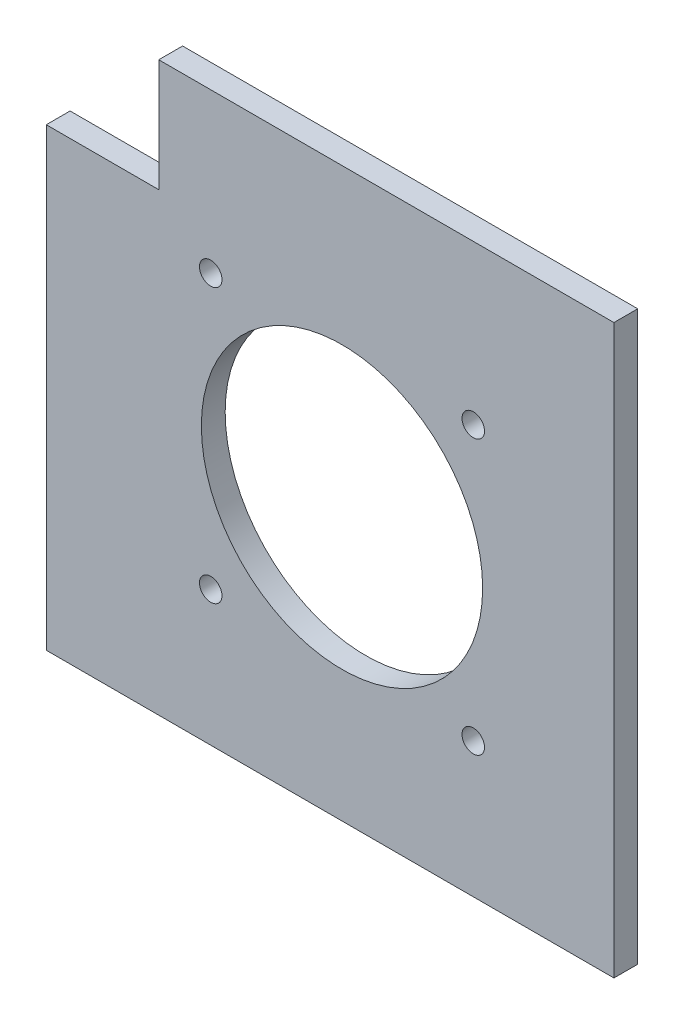
ISO-10303-21;
HEADER;
FILE_DESCRIPTION(('STEP AP214'),'2;1');
FILE_NAME('part.step','',(''),(''),'','','');
FILE_SCHEMA(('AUTOMOTIVE_DESIGN { 1 0 10303 214 1 1 1 1 }'));
ENDSEC;
DATA;
#1=APPLICATION_CONTEXT('core data for automotive mechanical design processes');
#2=APPLICATION_PROTOCOL_DEFINITION('international standard','automotive_design',2000,#1);
#3=PRODUCT_CONTEXT('',#1,'mechanical');
#4=PRODUCT('Part','Part','',(#3));
#5=PRODUCT_RELATED_PRODUCT_CATEGORY('part','',(#4));
#6=PRODUCT_DEFINITION_FORMATION('','',#4);
#7=PRODUCT_DEFINITION_CONTEXT('part definition',#1,'design');
#8=PRODUCT_DEFINITION('design','',#6,#7);
#9=PRODUCT_DEFINITION_SHAPE('','',#8);
#10=(LENGTH_UNIT() NAMED_UNIT(*) SI_UNIT(.MILLI.,.METRE.));
#11=(NAMED_UNIT(*) PLANE_ANGLE_UNIT() SI_UNIT($,.RADIAN.));
#12=(NAMED_UNIT(*) SI_UNIT($,.STERADIAN.) SOLID_ANGLE_UNIT());
#13=UNCERTAINTY_MEASURE_WITH_UNIT(LENGTH_MEASURE(1.E-05),#10,'distance_accuracy_value','');
#14=(GEOMETRIC_REPRESENTATION_CONTEXT(3) GLOBAL_UNCERTAINTY_ASSIGNED_CONTEXT((#13)) GLOBAL_UNIT_ASSIGNED_CONTEXT((#10,
#11,#12)) REPRESENTATION_CONTEXT('',''));
#15=CARTESIAN_POINT('',(0.,0.,0.));
#16=DIRECTION('',(0.,0.,1.));
#17=DIRECTION('',(1.,0.,0.));
#18=AXIS2_PLACEMENT_3D('',#15,#16,#17);
#19=CARTESIAN_POINT('',(100.993484022736,-125.866705607477,6.35));
#20=DIRECTION('',(-1.,0.,0.));
#21=DIRECTION('',(0.,-1.,0.));
#22=AXIS2_PLACEMENT_3D('',#19,#20,#21);
#23=PLANE('',#22);
#24=DIRECTION('',(0.,1.,0.));
#25=VECTOR('',#24,1.);
#26=CARTESIAN_POINT('',(100.993484022736,-125.866705607477,0.));
#27=LINE('',#26,#25);
#28=CARTESIAN_POINT('',(100.993484022736,-125.866705607477,0.));
#29=VERTEX_POINT('',#28);
#30=CARTESIAN_POINT('',(100.993484022736,25.4832943925233,0.));
#31=VERTEX_POINT('',#30);
#32=EDGE_CURVE('E131',#29,#31,#27,.T.);
#33=ORIENTED_EDGE('',*,*,#32,.T.);
#34=DIRECTION('',(0.,0.,-1.));
#35=VECTOR('',#34,1.);
#36=CARTESIAN_POINT('',(100.993484022736,25.4832943925233,6.35));
#37=LINE('',#36,#35);
#38=CARTESIAN_POINT('',(100.993484022736,25.4832943925233,6.35));
#39=VERTEX_POINT('',#38);
#40=EDGE_CURVE('E11',#39,#31,#37,.T.);
#41=ORIENTED_EDGE('',*,*,#40,.F.);
#42=DIRECTION('',(0.,1.,0.));
#43=VECTOR('',#42,1.);
#44=CARTESIAN_POINT('',(100.993484022736,-125.866705607477,6.35));
#45=LINE('',#44,#43);
#46=CARTESIAN_POINT('',(100.993484022736,-125.866705607477,6.35));
#47=VERTEX_POINT('',#46);
#48=EDGE_CURVE('E148',#47,#39,#45,.T.);
#49=ORIENTED_EDGE('',*,*,#48,.F.);
#50=DIRECTION('',(0.,0.,-1.));
#51=VECTOR('',#50,1.);
#52=CARTESIAN_POINT('',(100.993484022736,-125.866705607477,6.35));
#53=LINE('',#52,#51);
#54=EDGE_CURVE('E127',#47,#29,#53,.T.);
#55=ORIENTED_EDGE('',*,*,#54,.T.);
#56=EDGE_LOOP('',(#33,#41,#49,#55));
#57=FACE_BOUND('',#56,.T.);
#58=ADVANCED_FACE('F42',(#57),#23,.F.);
#59=CARTESIAN_POINT('',(100.993484022736,25.4832943925233,6.35));
#60=DIRECTION('',(0.,-1.,0.));
#61=DIRECTION('',(1.,0.,0.));
#62=AXIS2_PLACEMENT_3D('',#59,#60,#61);
#63=PLANE('',#62);
#64=DIRECTION('',(-1.,0.,0.));
#65=VECTOR('',#64,1.);
#66=CARTESIAN_POINT('',(100.993484022736,25.4832943925233,0.));
#67=LINE('',#66,#65);
#68=CARTESIAN_POINT('',(-20.3565159772635,25.4832943925234,0.));
#69=VERTEX_POINT('',#68);
#70=EDGE_CURVE('E135',#31,#69,#67,.T.);
#71=ORIENTED_EDGE('',*,*,#70,.T.);
#72=DIRECTION('',(0.,0.,-1.));
#73=VECTOR('',#72,1.);
#74=CARTESIAN_POINT('',(-20.3565159772635,25.4832943925234,6.35));
#75=LINE('',#74,#73);
#76=CARTESIAN_POINT('',(-20.3565159772635,25.4832943925234,6.35));
#77=VERTEX_POINT('',#76);
#78=EDGE_CURVE('E51',#77,#69,#75,.T.);
#79=ORIENTED_EDGE('',*,*,#78,.F.);
#80=DIRECTION('',(-1.,0.,0.));
#81=VECTOR('',#80,1.);
#82=CARTESIAN_POINT('',(100.993484022736,25.4832943925233,6.35));
#83=LINE('',#82,#81);
#84=EDGE_CURVE('E96',#39,#77,#83,.T.);
#85=ORIENTED_EDGE('',*,*,#84,.F.);
#86=ORIENTED_EDGE('',*,*,#40,.T.);
#87=EDGE_LOOP('',(#71,#79,#85,#86));
#88=FACE_BOUND('',#87,.T.);
#89=ADVANCED_FACE('F178',(#88),#63,.F.);
#90=CARTESIAN_POINT('',(-20.3565159772635,25.4832943925234,6.35));
#91=DIRECTION('',(1.,0.,0.));
#92=DIRECTION('',(0.,0.,-1.));
#93=AXIS2_PLACEMENT_3D('',#90,#91,#92);
#94=PLANE('',#93);
#95=DIRECTION('',(0.,-1.,0.));
#96=VECTOR('',#95,1.);
#97=CARTESIAN_POINT('',(-20.3565159772635,25.4832943925234,0.));
#98=LINE('',#97,#96);
#99=CARTESIAN_POINT('',(-20.3565159772635,-4.51670560747663,0.));
#100=VERTEX_POINT('',#99);
#101=EDGE_CURVE('E139',#69,#100,#98,.T.);
#102=ORIENTED_EDGE('',*,*,#101,.T.);
#103=DIRECTION('',(0.,0.,-1.));
#104=VECTOR('',#103,1.);
#105=CARTESIAN_POINT('',(-20.3565159772635,-4.51670560747663,6.35));
#106=LINE('',#105,#104);
#107=CARTESIAN_POINT('',(-20.3565159772635,-4.51670560747663,6.35));
#108=VERTEX_POINT('',#107);
#109=EDGE_CURVE('E120',#108,#100,#106,.T.);
#110=ORIENTED_EDGE('',*,*,#109,.F.);
#111=DIRECTION('',(0.,-1.,0.));
#112=VECTOR('',#111,1.);
#113=CARTESIAN_POINT('',(-20.3565159772635,25.4832943925234,6.35));
#114=LINE('',#113,#112);
#115=EDGE_CURVE('E109',#77,#108,#114,.T.);
#116=ORIENTED_EDGE('',*,*,#115,.F.);
#117=ORIENTED_EDGE('',*,*,#78,.T.);
#118=EDGE_LOOP('',(#102,#110,#116,#117));
#119=FACE_BOUND('',#118,.T.);
#120=ADVANCED_FACE('F158',(#119),#94,.F.);
#121=CARTESIAN_POINT('',(-50.3565159772635,-4.51670560747663,6.35));
#122=DIRECTION('',(0.,-1.,0.));
#123=DIRECTION('',(0.,0.,-1.));
#124=AXIS2_PLACEMENT_3D('',#121,#122,#123);
#125=PLANE('',#124);
#126=DIRECTION('',(-1.,0.,0.));
#127=VECTOR('',#126,1.);
#128=CARTESIAN_POINT('',(-50.3565159772635,-4.51670560747663,0.));
#129=LINE('',#128,#127);
#130=CARTESIAN_POINT('',(-50.3565159772635,-4.51670560747663,0.));
#131=VERTEX_POINT('',#130);
#132=EDGE_CURVE('E118',#100,#131,#129,.T.);
#133=ORIENTED_EDGE('',*,*,#132,.T.);
#134=DIRECTION('',(0.,0.,-1.));
#135=VECTOR('',#134,1.);
#136=CARTESIAN_POINT('',(-50.3565159772635,-4.51670560747663,6.35));
#137=LINE('',#136,#135);
#138=CARTESIAN_POINT('',(-50.3565159772635,-4.51670560747663,6.35));
#139=VERTEX_POINT('',#138);
#140=EDGE_CURVE('E115',#139,#131,#137,.T.);
#141=ORIENTED_EDGE('',*,*,#140,.F.);
#142=DIRECTION('',(-1.,0.,0.));
#143=VECTOR('',#142,1.);
#144=CARTESIAN_POINT('',(-50.3565159772635,-4.51670560747663,6.35));
#145=LINE('',#144,#143);
#146=EDGE_CURVE('E103',#108,#139,#145,.T.);
#147=ORIENTED_EDGE('',*,*,#146,.F.);
#148=ORIENTED_EDGE('',*,*,#109,.T.);
#149=EDGE_LOOP('',(#133,#141,#147,#148));
#150=FACE_BOUND('',#149,.T.);
#151=ADVANCED_FACE('F116',(#150),#125,.F.);
#152=CARTESIAN_POINT('',(-50.3565159772635,-4.51670560747663,6.35));
#153=DIRECTION('',(1.,0.,0.));
#154=DIRECTION('',(0.,0.,-1.));
#155=AXIS2_PLACEMENT_3D('',#152,#153,#154);
#156=PLANE('',#155);
#157=DIRECTION('',(0.,-1.,0.));
#158=VECTOR('',#157,1.);
#159=CARTESIAN_POINT('',(-50.3565159772635,-4.51670560747663,0.));
#160=LINE('',#159,#158);
#161=CARTESIAN_POINT('',(-50.3565159772635,-125.866705607477,0.));
#162=VERTEX_POINT('',#161);
#163=EDGE_CURVE('E82',#131,#162,#160,.T.);
#164=ORIENTED_EDGE('',*,*,#163,.T.);
#165=DIRECTION('',(0.,0.,-1.));
#166=VECTOR('',#165,1.);
#167=CARTESIAN_POINT('',(-50.3565159772635,-125.866705607477,6.35));
#168=LINE('',#167,#166);
#169=CARTESIAN_POINT('',(-50.3565159772635,-125.866705607477,6.35));
#170=VERTEX_POINT('',#169);
#171=EDGE_CURVE('E121',#170,#162,#168,.T.);
#172=ORIENTED_EDGE('',*,*,#171,.F.);
#173=DIRECTION('',(0.,-1.,0.));
#174=VECTOR('',#173,1.);
#175=CARTESIAN_POINT('',(-50.3565159772635,-4.51670560747663,6.35));
#176=LINE('',#175,#174);
#177=EDGE_CURVE('E107',#139,#170,#176,.T.);
#178=ORIENTED_EDGE('',*,*,#177,.F.);
#179=ORIENTED_EDGE('',*,*,#140,.T.);
#180=EDGE_LOOP('',(#164,#172,#178,#179));
#181=FACE_BOUND('',#180,.T.);
#182=ADVANCED_FACE('F123',(#181),#156,.F.);
#183=CARTESIAN_POINT('',(-50.3565159772635,-125.866705607477,6.35));
#184=DIRECTION('',(0.,1.,0.));
#185=DIRECTION('',(-1.,0.,0.));
#186=AXIS2_PLACEMENT_3D('',#183,#184,#185);
#187=PLANE('',#186);
#188=DIRECTION('',(1.,0.,0.));
#189=VECTOR('',#188,1.);
#190=CARTESIAN_POINT('',(-50.3565159772635,-125.866705607477,0.));
#191=LINE('',#190,#189);
#192=EDGE_CURVE('E88',#162,#29,#191,.T.);
#193=ORIENTED_EDGE('',*,*,#192,.T.);
#194=ORIENTED_EDGE('',*,*,#54,.F.);
#195=DIRECTION('',(1.,0.,0.));
#196=VECTOR('',#195,1.);
#197=CARTESIAN_POINT('',(-50.3565159772635,-125.866705607477,6.35));
#198=LINE('',#197,#196);
#199=EDGE_CURVE('E59',#170,#47,#198,.T.);
#200=ORIENTED_EDGE('',*,*,#199,.F.);
#201=ORIENTED_EDGE('',*,*,#171,.T.);
#202=EDGE_LOOP('',(#193,#194,#200,#201));
#203=FACE_BOUND('',#202,.T.);
#204=ADVANCED_FACE('F165',(#203),#187,.F.);
#205=CARTESIAN_POINT('',(0.,0.,6.35));
#206=DIRECTION('',(0.,0.,1.));
#207=DIRECTION('',(1.,0.,0.));
#208=AXIS2_PLACEMENT_3D('',#205,#206,#207);
#209=PLANE('',#208);
#210=CARTESIAN_POINT('',(63.4934840227365,-89.8667056074766,6.35));
#211=DIRECTION('',(0.,0.,1.));
#212=DIRECTION('',(-1.,0.,0.));
#213=AXIS2_PLACEMENT_3D('',#210,#211,#212);
#214=CIRCLE('',#213,3.);
#215=CARTESIAN_POINT('',(60.4934840227365,-89.8667056074766,6.35));
#216=VERTEX_POINT('',#215);
#217=EDGE_CURVE('E313',#216,#216,#214,.T.);
#218=ORIENTED_EDGE('',*,*,#217,.F.);
#219=EDGE_LOOP('',(#218));
#220=FACE_BOUND('',#219,.T.);
#221=CARTESIAN_POINT('',(63.4934840227364,-16.8667056074766,6.35));
#222=DIRECTION('',(0.,0.,1.));
#223=DIRECTION('',(-1.,0.,0.));
#224=AXIS2_PLACEMENT_3D('',#221,#222,#223);
#225=CIRCLE('',#224,3.);
#226=CARTESIAN_POINT('',(60.4934840227364,-16.8667056074766,6.35));
#227=VERTEX_POINT('',#226);
#228=EDGE_CURVE('E320',#227,#227,#225,.T.);
#229=ORIENTED_EDGE('',*,*,#228,.F.);
#230=EDGE_LOOP('',(#229));
#231=FACE_BOUND('',#230,.T.);
#232=CARTESIAN_POINT('',(-6.5065159772635,-89.8667056074766,6.35));
#233=DIRECTION('',(0.,0.,1.));
#234=DIRECTION('',(1.,0.,0.));
#235=AXIS2_PLACEMENT_3D('',#232,#233,#234);
#236=CIRCLE('',#235,3.);
#237=CARTESIAN_POINT('',(-3.5065159772635,-89.8667056074766,6.35));
#238=VERTEX_POINT('',#237);
#239=EDGE_CURVE('E344',#238,#238,#236,.T.);
#240=ORIENTED_EDGE('',*,*,#239,.F.);
#241=EDGE_LOOP('',(#240));
#242=FACE_BOUND('',#241,.T.);
#243=CARTESIAN_POINT('',(-6.50651597726351,-16.8667056074766,6.35));
#244=DIRECTION('',(0.,0.,1.));
#245=DIRECTION('',(1.,0.,0.));
#246=AXIS2_PLACEMENT_3D('',#243,#244,#245);
#247=CIRCLE('',#246,3.);
#248=CARTESIAN_POINT('',(-3.50651597726351,-16.8667056074766,6.35));
#249=VERTEX_POINT('',#248);
#250=EDGE_CURVE('E332',#249,#249,#247,.T.);
#251=ORIENTED_EDGE('',*,*,#250,.F.);
#252=EDGE_LOOP('',(#251));
#253=FACE_BOUND('',#252,.T.);
#254=CARTESIAN_POINT('',(28.4934840227365,-53.3667056074766,6.35));
#255=DIRECTION('',(0.,0.,1.));
#256=DIRECTION('',(1.,0.,0.));
#257=AXIS2_PLACEMENT_3D('',#254,#255,#256);
#258=CIRCLE('',#257,37.5);
#259=CARTESIAN_POINT('',(65.9934840227365,-53.3667056074766,6.35));
#260=VERTEX_POINT('',#259);
#261=EDGE_CURVE('E328',#260,#260,#258,.T.);
#262=ORIENTED_EDGE('',*,*,#261,.F.);
#263=EDGE_LOOP('',(#262));
#264=FACE_BOUND('',#263,.T.);
#265=ORIENTED_EDGE('',*,*,#48,.T.);
#266=ORIENTED_EDGE('',*,*,#84,.T.);
#267=ORIENTED_EDGE('',*,*,#115,.T.);
#268=ORIENTED_EDGE('',*,*,#146,.T.);
#269=ORIENTED_EDGE('',*,*,#177,.T.);
#270=ORIENTED_EDGE('',*,*,#199,.T.);
#271=EDGE_LOOP('',(#265,#266,#267,#268,#269,#270));
#272=FACE_BOUND('',#271,.T.);
#273=ADVANCED_FACE('F105',(#220,#231,#242,#253,#264,#272),#209,.T.);
#274=CARTESIAN_POINT('',(0.,0.,0.));
#275=DIRECTION('',(0.,0.,1.));
#276=DIRECTION('',(1.,0.,0.));
#277=AXIS2_PLACEMENT_3D('',#274,#275,#276);
#278=PLANE('',#277);
#279=CARTESIAN_POINT('',(63.4934840227365,-89.8667056074766,0.));
#280=DIRECTION('',(0.,0.,1.));
#281=DIRECTION('',(-1.,0.,0.));
#282=AXIS2_PLACEMENT_3D('',#279,#280,#281);
#283=CIRCLE('',#282,3.);
#284=CARTESIAN_POINT('',(60.4934840227365,-89.8667056074766,0.));
#285=VERTEX_POINT('',#284);
#286=EDGE_CURVE('E310',#285,#285,#283,.T.);
#287=ORIENTED_EDGE('',*,*,#286,.T.);
#288=EDGE_LOOP('',(#287));
#289=FACE_BOUND('',#288,.T.);
#290=CARTESIAN_POINT('',(63.4934840227364,-16.8667056074766,0.));
#291=DIRECTION('',(0.,0.,1.));
#292=DIRECTION('',(-1.,0.,0.));
#293=AXIS2_PLACEMENT_3D('',#290,#291,#292);
#294=CIRCLE('',#293,3.);
#295=CARTESIAN_POINT('',(60.4934840227364,-16.8667056074766,0.));
#296=VERTEX_POINT('',#295);
#297=EDGE_CURVE('E315',#296,#296,#294,.T.);
#298=ORIENTED_EDGE('',*,*,#297,.T.);
#299=EDGE_LOOP('',(#298));
#300=FACE_BOUND('',#299,.T.);
#301=CARTESIAN_POINT('',(-6.5065159772635,-89.8667056074766,0.));
#302=DIRECTION('',(0.,0.,1.));
#303=DIRECTION('',(1.,0.,0.));
#304=AXIS2_PLACEMENT_3D('',#301,#302,#303);
#305=CIRCLE('',#304,3.);
#306=CARTESIAN_POINT('',(-3.5065159772635,-89.8667056074766,0.));
#307=VERTEX_POINT('',#306);
#308=EDGE_CURVE('E348',#307,#307,#305,.T.);
#309=ORIENTED_EDGE('',*,*,#308,.T.);
#310=EDGE_LOOP('',(#309));
#311=FACE_BOUND('',#310,.T.);
#312=CARTESIAN_POINT('',(-6.50651597726351,-16.8667056074766,0.));
#313=DIRECTION('',(0.,0.,1.));
#314=DIRECTION('',(1.,0.,0.));
#315=AXIS2_PLACEMENT_3D('',#312,#313,#314);
#316=CIRCLE('',#315,3.);
#317=CARTESIAN_POINT('',(-3.50651597726351,-16.8667056074766,0.));
#318=VERTEX_POINT('',#317);
#319=EDGE_CURVE('E340',#318,#318,#316,.T.);
#320=ORIENTED_EDGE('',*,*,#319,.T.);
#321=EDGE_LOOP('',(#320));
#322=FACE_BOUND('',#321,.T.);
#323=CARTESIAN_POINT('',(28.4934840227365,-53.3667056074766,0.));
#324=DIRECTION('',(0.,0.,1.));
#325=DIRECTION('',(1.,0.,0.));
#326=AXIS2_PLACEMENT_3D('',#323,#324,#325);
#327=CIRCLE('',#326,37.5);
#328=CARTESIAN_POINT('',(65.9934840227365,-53.3667056074766,0.));
#329=VERTEX_POINT('',#328);
#330=EDGE_CURVE('E136',#329,#329,#327,.T.);
#331=ORIENTED_EDGE('',*,*,#330,.T.);
#332=EDGE_LOOP('',(#331));
#333=FACE_BOUND('',#332,.T.);
#334=ORIENTED_EDGE('',*,*,#32,.F.);
#335=ORIENTED_EDGE('',*,*,#192,.F.);
#336=ORIENTED_EDGE('',*,*,#163,.F.);
#337=ORIENTED_EDGE('',*,*,#132,.F.);
#338=ORIENTED_EDGE('',*,*,#101,.F.);
#339=ORIENTED_EDGE('',*,*,#70,.F.);
#340=EDGE_LOOP('',(#334,#335,#336,#337,#338,#339));
#341=FACE_BOUND('',#340,.T.);
#342=ADVANCED_FACE('F161',(#289,#300,#311,#322,#333,#341),#278,.F.);
#343=CARTESIAN_POINT('',(28.4934840227365,-53.3667056074766,0.));
#344=DIRECTION('',(0.,0.,1.));
#345=DIRECTION('',(1.,0.,0.));
#346=AXIS2_PLACEMENT_3D('',#343,#344,#345);
#347=CYLINDRICAL_SURFACE('',#346,37.5);
#348=ORIENTED_EDGE('',*,*,#330,.F.);
#349=EDGE_LOOP('',(#348));
#350=FACE_BOUND('',#349,.T.);
#351=ORIENTED_EDGE('',*,*,#261,.T.);
#352=EDGE_LOOP('',(#351));
#353=FACE_BOUND('',#352,.T.);
#354=ADVANCED_FACE('F213',(#350,#353),#347,.F.);
#355=CARTESIAN_POINT('',(-6.50651597726351,-16.8667056074766,0.));
#356=DIRECTION('',(0.,0.,1.));
#357=DIRECTION('',(1.,0.,0.));
#358=AXIS2_PLACEMENT_3D('',#355,#356,#357);
#359=CYLINDRICAL_SURFACE('',#358,3.);
#360=ORIENTED_EDGE('',*,*,#319,.F.);
#361=EDGE_LOOP('',(#360));
#362=FACE_BOUND('',#361,.T.);
#363=ORIENTED_EDGE('',*,*,#250,.T.);
#364=EDGE_LOOP('',(#363));
#365=FACE_BOUND('',#364,.T.);
#366=ADVANCED_FACE('F221',(#362,#365),#359,.F.);
#367=CARTESIAN_POINT('',(-6.5065159772635,-89.8667056074766,0.));
#368=DIRECTION('',(0.,0.,1.));
#369=DIRECTION('',(1.,0.,0.));
#370=AXIS2_PLACEMENT_3D('',#367,#368,#369);
#371=CYLINDRICAL_SURFACE('',#370,3.);
#372=ORIENTED_EDGE('',*,*,#308,.F.);
#373=EDGE_LOOP('',(#372));
#374=FACE_BOUND('',#373,.T.);
#375=ORIENTED_EDGE('',*,*,#239,.T.);
#376=EDGE_LOOP('',(#375));
#377=FACE_BOUND('',#376,.T.);
#378=ADVANCED_FACE('F232',(#374,#377),#371,.F.);
#379=CARTESIAN_POINT('',(63.4934840227364,-16.8667056074766,0.));
#380=DIRECTION('',(0.,0.,1.));
#381=DIRECTION('',(1.,0.,0.));
#382=AXIS2_PLACEMENT_3D('',#379,#380,#381);
#383=CYLINDRICAL_SURFACE('',#382,3.);
#384=ORIENTED_EDGE('',*,*,#297,.F.);
#385=EDGE_LOOP('',(#384));
#386=FACE_BOUND('',#385,.T.);
#387=ORIENTED_EDGE('',*,*,#228,.T.);
#388=EDGE_LOOP('',(#387));
#389=FACE_BOUND('',#388,.T.);
#390=ADVANCED_FACE('F243',(#386,#389),#383,.F.);
#391=CARTESIAN_POINT('',(63.4934840227365,-89.8667056074766,0.));
#392=DIRECTION('',(0.,0.,1.));
#393=DIRECTION('',(1.,0.,0.));
#394=AXIS2_PLACEMENT_3D('',#391,#392,#393);
#395=CYLINDRICAL_SURFACE('',#394,3.);
#396=ORIENTED_EDGE('',*,*,#286,.F.);
#397=EDGE_LOOP('',(#396));
#398=FACE_BOUND('',#397,.T.);
#399=ORIENTED_EDGE('',*,*,#217,.T.);
#400=EDGE_LOOP('',(#399));
#401=FACE_BOUND('',#400,.T.);
#402=ADVANCED_FACE('F254',(#398,#401),#395,.F.);
#403=CLOSED_SHELL('',(#58,#89,#120,#151,#182,#204,#273,#342,#354,#366,#378,#390,#402));
#404=MANIFOLD_SOLID_BREP('B2',#403);
#405=ADVANCED_BREP_SHAPE_REPRESENTATION('',(#18,#404),#14);
#406=SHAPE_DEFINITION_REPRESENTATION(#9,#405);
ENDSEC;
END-ISO-10303-21;
